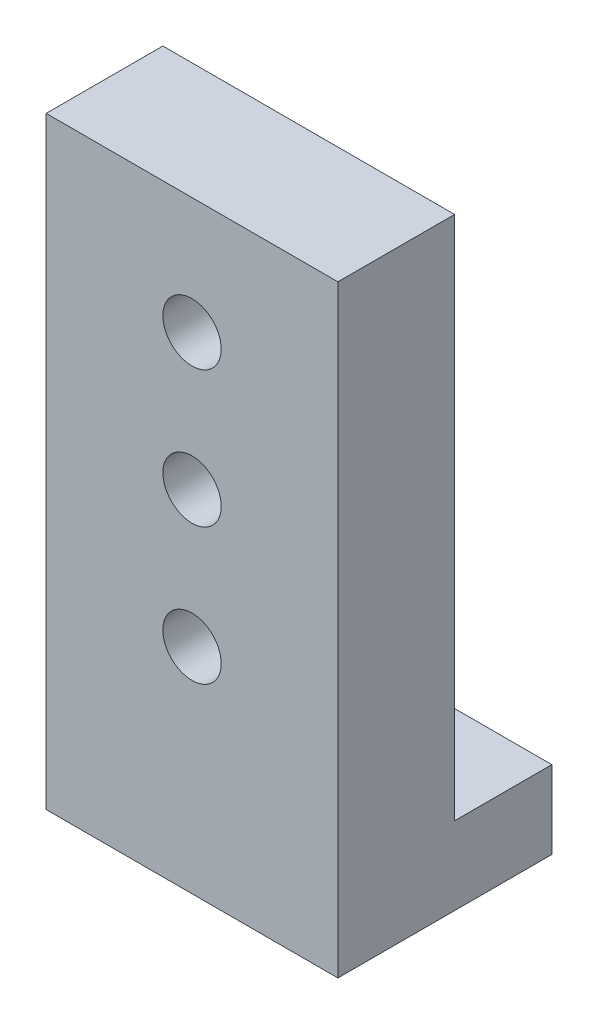
ISO-10303-21;
HEADER;
FILE_DESCRIPTION(('STEP AP214'),'2;1');
FILE_NAME('part.step','',(''),(''),'','','');
FILE_SCHEMA(('AUTOMOTIVE_DESIGN { 1 0 10303 214 1 1 1 1 }'));
ENDSEC;
DATA;
#1=APPLICATION_CONTEXT('core data for automotive mechanical design processes');
#2=APPLICATION_PROTOCOL_DEFINITION('international standard','automotive_design',2000,#1);
#3=PRODUCT_CONTEXT('',#1,'mechanical');
#4=PRODUCT('Part','Part','',(#3));
#5=PRODUCT_RELATED_PRODUCT_CATEGORY('part','',(#4));
#6=PRODUCT_DEFINITION_FORMATION('','',#4);
#7=PRODUCT_DEFINITION_CONTEXT('part definition',#1,'design');
#8=PRODUCT_DEFINITION('design','',#6,#7);
#9=PRODUCT_DEFINITION_SHAPE('','',#8);
#10=(LENGTH_UNIT() NAMED_UNIT(*) SI_UNIT(.MILLI.,.METRE.));
#11=(NAMED_UNIT(*) PLANE_ANGLE_UNIT() SI_UNIT($,.RADIAN.));
#12=(NAMED_UNIT(*) SI_UNIT($,.STERADIAN.) SOLID_ANGLE_UNIT());
#13=UNCERTAINTY_MEASURE_WITH_UNIT(LENGTH_MEASURE(1.E-05),#10,'distance_accuracy_value','');
#14=(GEOMETRIC_REPRESENTATION_CONTEXT(3) GLOBAL_UNCERTAINTY_ASSIGNED_CONTEXT((#13)) GLOBAL_UNIT_ASSIGNED_CONTEXT((#10,
#11,#12)) REPRESENTATION_CONTEXT('',''));
#15=CARTESIAN_POINT('',(0.,0.,0.));
#16=DIRECTION('',(0.,0.,1.));
#17=DIRECTION('',(1.,0.,0.));
#18=AXIS2_PLACEMENT_3D('',#15,#16,#17);
#19=CARTESIAN_POINT('',(7.5,-15.5,6.));
#20=DIRECTION('',(-1.,0.,0.));
#21=DIRECTION('',(0.,0.,1.));
#22=AXIS2_PLACEMENT_3D('',#19,#20,#21);
#23=PLANE('',#22);
#24=DIRECTION('',(0.,0.,-1.));
#25=VECTOR('',#24,1.);
#26=CARTESIAN_POINT('',(7.5,-15.5,6.));
#27=LINE('',#26,#25);
#28=CARTESIAN_POINT('',(7.5,-15.5,6.));
#29=VERTEX_POINT('',#28);
#30=CARTESIAN_POINT('',(7.5,-15.5,-5.));
#31=VERTEX_POINT('',#30);
#32=EDGE_CURVE('E100',#29,#31,#27,.T.);
#33=ORIENTED_EDGE('',*,*,#32,.T.);
#34=DIRECTION('',(0.,-1.,0.));
#35=VECTOR('',#34,1.);
#36=CARTESIAN_POINT('',(7.5,-15.5,-5.));
#37=LINE('',#36,#35);
#38=CARTESIAN_POINT('',(7.5,-11.5,-5.));
#39=VERTEX_POINT('',#38);
#40=EDGE_CURVE('E114',#39,#31,#37,.T.);
#41=ORIENTED_EDGE('',*,*,#40,.F.);
#42=DIRECTION('',(0.,0.,1.));
#43=VECTOR('',#42,1.);
#44=CARTESIAN_POINT('',(7.5,-11.5,-5.));
#45=LINE('',#44,#43);
#46=CARTESIAN_POINT('',(7.5,-11.5,0.));
#47=VERTEX_POINT('',#46);
#48=EDGE_CURVE('E119',#39,#47,#45,.T.);
#49=ORIENTED_EDGE('',*,*,#48,.T.);
#50=DIRECTION('',(0.,1.,0.));
#51=VECTOR('',#50,1.);
#52=CARTESIAN_POINT('',(7.5,-15.5,0.));
#53=LINE('',#52,#51);
#54=CARTESIAN_POINT('',(7.5,15.5,0.));
#55=VERTEX_POINT('',#54);
#56=EDGE_CURVE('E140',#47,#55,#53,.T.);
#57=ORIENTED_EDGE('',*,*,#56,.T.);
#58=DIRECTION('',(0.,0.,-1.));
#59=VECTOR('',#58,1.);
#60=CARTESIAN_POINT('',(7.5,15.5,6.));
#61=LINE('',#60,#59);
#62=CARTESIAN_POINT('',(7.5,15.5,6.));
#63=VERTEX_POINT('',#62);
#64=EDGE_CURVE('E11',#63,#55,#61,.T.);
#65=ORIENTED_EDGE('',*,*,#64,.F.);
#66=DIRECTION('',(0.,1.,0.));
#67=VECTOR('',#66,1.);
#68=CARTESIAN_POINT('',(7.5,-15.5,6.));
#69=LINE('',#68,#67);
#70=EDGE_CURVE('E143',#29,#63,#69,.T.);
#71=ORIENTED_EDGE('',*,*,#70,.F.);
#72=EDGE_LOOP('',(#33,#41,#49,#57,#65,#71));
#73=FACE_BOUND('',#72,.T.);
#74=ADVANCED_FACE('F33',(#73),#23,.F.);
#75=CARTESIAN_POINT('',(-7.5,15.5,6.));
#76=DIRECTION('',(0.,-1.,0.));
#77=DIRECTION('',(0.,0.,-1.));
#78=AXIS2_PLACEMENT_3D('',#75,#76,#77);
#79=PLANE('',#78);
#80=DIRECTION('',(-1.,0.,0.));
#81=VECTOR('',#80,1.);
#82=CARTESIAN_POINT('',(-7.5,15.5,0.));
#83=LINE('',#82,#81);
#84=CARTESIAN_POINT('',(-7.5,15.5,0.));
#85=VERTEX_POINT('',#84);
#86=EDGE_CURVE('E71',#55,#85,#83,.T.);
#87=ORIENTED_EDGE('',*,*,#86,.T.);
#88=DIRECTION('',(0.,0.,-1.));
#89=VECTOR('',#88,1.);
#90=CARTESIAN_POINT('',(-7.5,15.5,6.));
#91=LINE('',#90,#89);
#92=CARTESIAN_POINT('',(-7.5,15.5,6.));
#93=VERTEX_POINT('',#92);
#94=EDGE_CURVE('E40',#93,#85,#91,.T.);
#95=ORIENTED_EDGE('',*,*,#94,.F.);
#96=DIRECTION('',(-1.,0.,0.));
#97=VECTOR('',#96,1.);
#98=CARTESIAN_POINT('',(-7.5,15.5,6.));
#99=LINE('',#98,#97);
#100=EDGE_CURVE('E76',#63,#93,#99,.T.);
#101=ORIENTED_EDGE('',*,*,#100,.F.);
#102=ORIENTED_EDGE('',*,*,#64,.T.);
#103=EDGE_LOOP('',(#87,#95,#101,#102));
#104=FACE_BOUND('',#103,.T.);
#105=ADVANCED_FACE('F156',(#104),#79,.F.);
#106=CARTESIAN_POINT('',(-7.5,-15.5,6.));
#107=DIRECTION('',(1.,0.,0.));
#108=DIRECTION('',(0.,0.,-1.));
#109=AXIS2_PLACEMENT_3D('',#106,#107,#108);
#110=PLANE('',#109);
#111=DIRECTION('',(0.,-1.,0.));
#112=VECTOR('',#111,1.);
#113=CARTESIAN_POINT('',(-7.5,-15.5,0.));
#114=LINE('',#113,#112);
#115=CARTESIAN_POINT('',(-7.5,-11.5,0.));
#116=VERTEX_POINT('',#115);
#117=EDGE_CURVE('E145',#85,#116,#114,.T.);
#118=ORIENTED_EDGE('',*,*,#117,.T.);
#119=DIRECTION('',(0.,0.,1.));
#120=VECTOR('',#119,1.);
#121=CARTESIAN_POINT('',(-7.5,-11.5,-5.));
#122=LINE('',#121,#120);
#123=CARTESIAN_POINT('',(-7.5,-11.5,-5.));
#124=VERTEX_POINT('',#123);
#125=EDGE_CURVE('E106',#124,#116,#122,.T.);
#126=ORIENTED_EDGE('',*,*,#125,.F.);
#127=DIRECTION('',(0.,1.,0.));
#128=VECTOR('',#127,1.);
#129=CARTESIAN_POINT('',(-7.5,-11.5,-5.));
#130=LINE('',#129,#128);
#131=CARTESIAN_POINT('',(-7.5,-15.5,-5.));
#132=VERTEX_POINT('',#131);
#133=EDGE_CURVE('E103',#132,#124,#130,.T.);
#134=ORIENTED_EDGE('',*,*,#133,.F.);
#135=DIRECTION('',(0.,0.,-1.));
#136=VECTOR('',#135,1.);
#137=CARTESIAN_POINT('',(-7.5,-15.5,6.));
#138=LINE('',#137,#136);
#139=CARTESIAN_POINT('',(-7.5,-15.5,6.));
#140=VERTEX_POINT('',#139);
#141=EDGE_CURVE('E93',#140,#132,#138,.T.);
#142=ORIENTED_EDGE('',*,*,#141,.F.);
#143=DIRECTION('',(0.,-1.,0.));
#144=VECTOR('',#143,1.);
#145=CARTESIAN_POINT('',(-7.5,-15.5,6.));
#146=LINE('',#145,#144);
#147=EDGE_CURVE('E147',#93,#140,#146,.T.);
#148=ORIENTED_EDGE('',*,*,#147,.F.);
#149=ORIENTED_EDGE('',*,*,#94,.T.);
#150=EDGE_LOOP('',(#118,#126,#134,#142,#148,#149));
#151=FACE_BOUND('',#150,.T.);
#152=ADVANCED_FACE('F104',(#151),#110,.F.);
#153=CARTESIAN_POINT('',(-7.5,-15.5,6.));
#154=DIRECTION('',(0.,1.,0.));
#155=DIRECTION('',(0.,0.,1.));
#156=AXIS2_PLACEMENT_3D('',#153,#154,#155);
#157=PLANE('',#156);
#158=ORIENTED_EDGE('',*,*,#141,.T.);
#159=DIRECTION('',(-1.,0.,0.));
#160=VECTOR('',#159,1.);
#161=CARTESIAN_POINT('',(-7.5,-15.5,-5.));
#162=LINE('',#161,#160);
#163=EDGE_CURVE('E97',#31,#132,#162,.T.);
#164=ORIENTED_EDGE('',*,*,#163,.F.);
#165=ORIENTED_EDGE('',*,*,#32,.F.);
#166=DIRECTION('',(1.,0.,0.));
#167=VECTOR('',#166,1.);
#168=CARTESIAN_POINT('',(-7.5,-15.5,6.));
#169=LINE('',#168,#167);
#170=EDGE_CURVE('E56',#140,#29,#169,.T.);
#171=ORIENTED_EDGE('',*,*,#170,.F.);
#172=EDGE_LOOP('',(#158,#164,#165,#171));
#173=FACE_BOUND('',#172,.T.);
#174=ADVANCED_FACE('F95',(#173),#157,.F.);
#175=CARTESIAN_POINT('',(0.,0.,6.));
#176=DIRECTION('',(0.,0.,-1.));
#177=DIRECTION('',(-1.,0.,0.));
#178=AXIS2_PLACEMENT_3D('',#175,#176,#177);
#179=PLANE('',#178);
#180=CARTESIAN_POINT('',(0.,2.5,6.));
#181=DIRECTION('',(0.,0.,1.));
#182=DIRECTION('',(1.,0.,0.));
#183=AXIS2_PLACEMENT_3D('',#180,#181,#182);
#184=CIRCLE('',#183,1.5);
#185=CARTESIAN_POINT('',(1.5,2.5,6.));
#186=VERTEX_POINT('',#185);
#187=EDGE_CURVE('E129',#186,#186,#184,.T.);
#188=ORIENTED_EDGE('',*,*,#187,.F.);
#189=EDGE_LOOP('',(#188));
#190=FACE_BOUND('',#189,.T.);
#191=CARTESIAN_POINT('',(0.,-4.5,6.));
#192=DIRECTION('',(0.,0.,1.));
#193=DIRECTION('',(1.,0.,0.));
#194=AXIS2_PLACEMENT_3D('',#191,#192,#193);
#195=CIRCLE('',#194,1.5);
#196=CARTESIAN_POINT('',(1.5,-4.5,6.));
#197=VERTEX_POINT('',#196);
#198=EDGE_CURVE('E124',#197,#197,#195,.T.);
#199=ORIENTED_EDGE('',*,*,#198,.F.);
#200=EDGE_LOOP('',(#199));
#201=FACE_BOUND('',#200,.T.);
#202=CARTESIAN_POINT('',(0.,9.5,6.));
#203=DIRECTION('',(0.,0.,1.));
#204=DIRECTION('',(1.,0.,0.));
#205=AXIS2_PLACEMENT_3D('',#202,#203,#204);
#206=CIRCLE('',#205,1.5);
#207=CARTESIAN_POINT('',(1.5,9.5,6.));
#208=VERTEX_POINT('',#207);
#209=EDGE_CURVE('E128',#208,#208,#206,.T.);
#210=ORIENTED_EDGE('',*,*,#209,.F.);
#211=EDGE_LOOP('',(#210));
#212=FACE_BOUND('',#211,.T.);
#213=ORIENTED_EDGE('',*,*,#70,.T.);
#214=ORIENTED_EDGE('',*,*,#100,.T.);
#215=ORIENTED_EDGE('',*,*,#147,.T.);
#216=ORIENTED_EDGE('',*,*,#170,.T.);
#217=EDGE_LOOP('',(#213,#214,#215,#216));
#218=FACE_BOUND('',#217,.T.);
#219=ADVANCED_FACE('F184',(#190,#201,#212,#218),#179,.F.);
#220=CARTESIAN_POINT('',(0.,0.,0.));
#221=DIRECTION('',(0.,0.,-1.));
#222=DIRECTION('',(-1.,0.,0.));
#223=AXIS2_PLACEMENT_3D('',#220,#221,#222);
#224=PLANE('',#223);
#225=DIRECTION('',(1.,0.,0.));
#226=VECTOR('',#225,1.);
#227=CARTESIAN_POINT('',(7.5,-11.5,0.));
#228=LINE('',#227,#226);
#229=EDGE_CURVE('E47',#116,#47,#228,.T.);
#230=ORIENTED_EDGE('',*,*,#229,.F.);
#231=ORIENTED_EDGE('',*,*,#117,.F.);
#232=ORIENTED_EDGE('',*,*,#86,.F.);
#233=ORIENTED_EDGE('',*,*,#56,.F.);
#234=EDGE_LOOP('',(#230,#231,#232,#233));
#235=FACE_BOUND('',#234,.T.);
#236=CARTESIAN_POINT('',(0.,2.5,0.));
#237=DIRECTION('',(0.,0.,1.));
#238=DIRECTION('',(1.,0.,0.));
#239=AXIS2_PLACEMENT_3D('',#236,#237,#238);
#240=CIRCLE('',#239,1.5);
#241=CARTESIAN_POINT('',(1.5,2.5,0.));
#242=VERTEX_POINT('',#241);
#243=EDGE_CURVE('E125',#242,#242,#240,.T.);
#244=ORIENTED_EDGE('',*,*,#243,.T.);
#245=EDGE_LOOP('',(#244));
#246=FACE_BOUND('',#245,.T.);
#247=CARTESIAN_POINT('',(0.,-4.5,0.));
#248=DIRECTION('',(0.,0.,1.));
#249=DIRECTION('',(1.,0.,0.));
#250=AXIS2_PLACEMENT_3D('',#247,#248,#249);
#251=CIRCLE('',#250,1.5);
#252=CARTESIAN_POINT('',(1.5,-4.5,0.));
#253=VERTEX_POINT('',#252);
#254=EDGE_CURVE('E132',#253,#253,#251,.T.);
#255=ORIENTED_EDGE('',*,*,#254,.T.);
#256=EDGE_LOOP('',(#255));
#257=FACE_BOUND('',#256,.T.);
#258=CARTESIAN_POINT('',(0.,9.5,0.));
#259=DIRECTION('',(0.,0.,1.));
#260=DIRECTION('',(1.,0.,0.));
#261=AXIS2_PLACEMENT_3D('',#258,#259,#260);
#262=CIRCLE('',#261,1.5);
#263=CARTESIAN_POINT('',(1.5,9.5,0.));
#264=VERTEX_POINT('',#263);
#265=EDGE_CURVE('E137',#264,#264,#262,.T.);
#266=ORIENTED_EDGE('',*,*,#265,.T.);
#267=EDGE_LOOP('',(#266));
#268=FACE_BOUND('',#267,.T.);
#269=ADVANCED_FACE('F153',(#235,#246,#257,#268),#224,.T.);
#270=CARTESIAN_POINT('',(0.,9.5,0.));
#271=DIRECTION('',(0.,0.,1.));
#272=DIRECTION('',(1.,0.,0.));
#273=AXIS2_PLACEMENT_3D('',#270,#271,#272);
#274=CYLINDRICAL_SURFACE('',#273,1.5);
#275=ORIENTED_EDGE('',*,*,#265,.F.);
#276=EDGE_LOOP('',(#275));
#277=FACE_BOUND('',#276,.T.);
#278=ORIENTED_EDGE('',*,*,#209,.T.);
#279=EDGE_LOOP('',(#278));
#280=FACE_BOUND('',#279,.T.);
#281=ADVANCED_FACE('F187',(#277,#280),#274,.F.);
#282=CARTESIAN_POINT('',(0.,-4.5,0.));
#283=DIRECTION('',(0.,0.,1.));
#284=DIRECTION('',(1.,0.,0.));
#285=AXIS2_PLACEMENT_3D('',#282,#283,#284);
#286=CYLINDRICAL_SURFACE('',#285,1.5);
#287=ORIENTED_EDGE('',*,*,#254,.F.);
#288=EDGE_LOOP('',(#287));
#289=FACE_BOUND('',#288,.T.);
#290=ORIENTED_EDGE('',*,*,#198,.T.);
#291=EDGE_LOOP('',(#290));
#292=FACE_BOUND('',#291,.T.);
#293=ADVANCED_FACE('F170',(#289,#292),#286,.F.);
#294=CARTESIAN_POINT('',(0.,2.5,0.));
#295=DIRECTION('',(0.,0.,1.));
#296=DIRECTION('',(1.,0.,0.));
#297=AXIS2_PLACEMENT_3D('',#294,#295,#296);
#298=CYLINDRICAL_SURFACE('',#297,1.5);
#299=ORIENTED_EDGE('',*,*,#243,.F.);
#300=EDGE_LOOP('',(#299));
#301=FACE_BOUND('',#300,.T.);
#302=ORIENTED_EDGE('',*,*,#187,.T.);
#303=EDGE_LOOP('',(#302));
#304=FACE_BOUND('',#303,.T.);
#305=ADVANCED_FACE('F163',(#301,#304),#298,.F.);
#306=CARTESIAN_POINT('',(7.5,-11.5,-5.));
#307=DIRECTION('',(0.,-1.,0.));
#308=DIRECTION('',(1.,0.,0.));
#309=AXIS2_PLACEMENT_3D('',#306,#307,#308);
#310=PLANE('',#309);
#311=ORIENTED_EDGE('',*,*,#229,.T.);
#312=ORIENTED_EDGE('',*,*,#48,.F.);
#313=DIRECTION('',(1.,0.,0.));
#314=VECTOR('',#313,1.);
#315=CARTESIAN_POINT('',(7.5,-11.5,-5.));
#316=LINE('',#315,#314);
#317=EDGE_CURVE('E109',#124,#39,#316,.T.);
#318=ORIENTED_EDGE('',*,*,#317,.F.);
#319=ORIENTED_EDGE('',*,*,#125,.T.);
#320=EDGE_LOOP('',(#311,#312,#318,#319));
#321=FACE_BOUND('',#320,.T.);
#322=ADVANCED_FACE('F161',(#321),#310,.F.);
#323=CARTESIAN_POINT('',(0.,0.,-5.));
#324=DIRECTION('',(0.,0.,1.));
#325=DIRECTION('',(1.,0.,0.));
#326=AXIS2_PLACEMENT_3D('',#323,#324,#325);
#327=PLANE('',#326);
#328=ORIENTED_EDGE('',*,*,#163,.T.);
#329=ORIENTED_EDGE('',*,*,#133,.T.);
#330=ORIENTED_EDGE('',*,*,#317,.T.);
#331=ORIENTED_EDGE('',*,*,#40,.T.);
#332=EDGE_LOOP('',(#328,#329,#330,#331));
#333=FACE_BOUND('',#332,.T.);
#334=ADVANCED_FACE('F112',(#333),#327,.F.);
#335=CLOSED_SHELL('',(#74,#105,#152,#174,#219,#269,#281,#293,#305,#322,#334));
#336=MANIFOLD_SOLID_BREP('B2',#335);
#337=ADVANCED_BREP_SHAPE_REPRESENTATION('',(#18,#336),#14);
#338=SHAPE_DEFINITION_REPRESENTATION(#9,#337);
ENDSEC;
END-ISO-10303-21;
